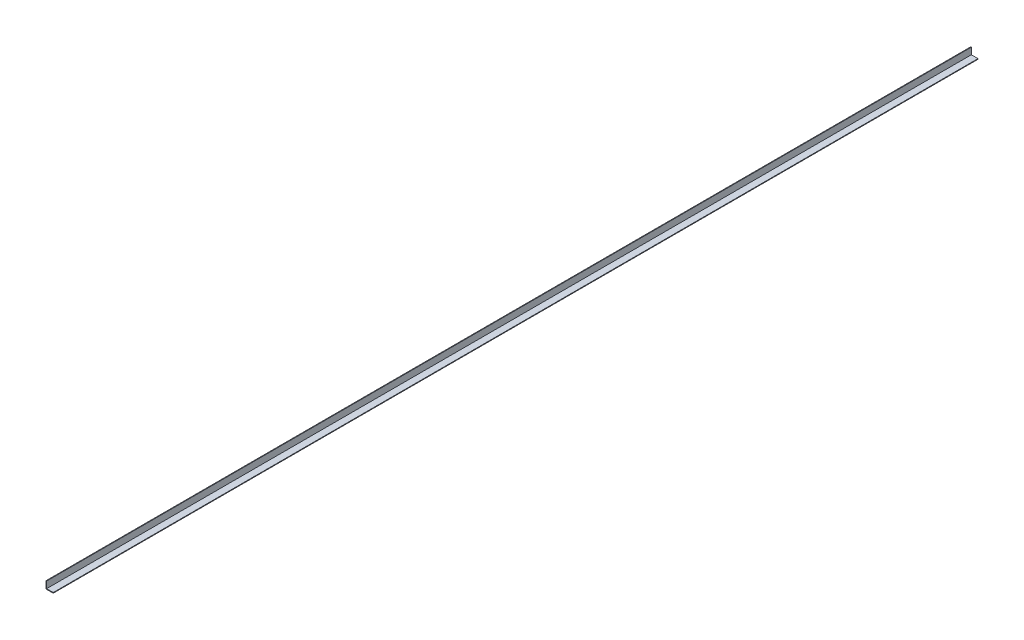
ISO-10303-21;
HEADER;
FILE_DESCRIPTION(('STEP AP214'),'2;1');
FILE_NAME('part.step','',(''),(''),'','','');
FILE_SCHEMA(('AUTOMOTIVE_DESIGN { 1 0 10303 214 1 1 1 1 }'));
ENDSEC;
DATA;
#1=APPLICATION_CONTEXT('core data for automotive mechanical design processes');
#2=APPLICATION_PROTOCOL_DEFINITION('international standard','automotive_design',2000,#1);
#3=PRODUCT_CONTEXT('',#1,'mechanical');
#4=PRODUCT('Part','Part','',(#3));
#5=PRODUCT_RELATED_PRODUCT_CATEGORY('part','',(#4));
#6=PRODUCT_DEFINITION_FORMATION('','',#4);
#7=PRODUCT_DEFINITION_CONTEXT('part definition',#1,'design');
#8=PRODUCT_DEFINITION('design','',#6,#7);
#9=PRODUCT_DEFINITION_SHAPE('','',#8);
#10=(LENGTH_UNIT() NAMED_UNIT(*) SI_UNIT(.MILLI.,.METRE.));
#11=(NAMED_UNIT(*) PLANE_ANGLE_UNIT() SI_UNIT($,.RADIAN.));
#12=(NAMED_UNIT(*) SI_UNIT($,.STERADIAN.) SOLID_ANGLE_UNIT());
#13=UNCERTAINTY_MEASURE_WITH_UNIT(LENGTH_MEASURE(1.E-05),#10,'distance_accuracy_value','');
#14=(GEOMETRIC_REPRESENTATION_CONTEXT(3) GLOBAL_UNCERTAINTY_ASSIGNED_CONTEXT((#13)) GLOBAL_UNIT_ASSIGNED_CONTEXT((#10,
#11,#12)) REPRESENTATION_CONTEXT('',''));
#15=CARTESIAN_POINT('',(0.,0.,0.));
#16=DIRECTION('',(0.,0.,1.));
#17=DIRECTION('',(1.,0.,0.));
#18=AXIS2_PLACEMENT_3D('',#15,#16,#17);
#19=CARTESIAN_POINT('',(19.05,-7.9375,2438.4));
#20=DIRECTION('',(-1.,0.,0.));
#21=DIRECTION('',(0.,-1.,0.));
#22=AXIS2_PLACEMENT_3D('',#19,#20,#21);
#23=PLANE('',#22);
#24=DIRECTION('',(0.,1.,0.));
#25=VECTOR('',#24,1.);
#26=CARTESIAN_POINT('',(19.05,-7.9375,0.));
#27=LINE('',#26,#25);
#28=CARTESIAN_POINT('',(19.05,-9.52500000000001,0.));
#29=VERTEX_POINT('',#28);
#30=CARTESIAN_POINT('',(19.05,-7.9375,0.));
#31=VERTEX_POINT('',#30);
#32=EDGE_CURVE('E117',#29,#31,#27,.T.);
#33=ORIENTED_EDGE('',*,*,#32,.T.);
#34=DIRECTION('',(0.,0.,-1.));
#35=VECTOR('',#34,1.);
#36=CARTESIAN_POINT('',(19.05,-7.9375,2438.4));
#37=LINE('',#36,#35);
#38=CARTESIAN_POINT('',(19.05,-7.9375,2438.4));
#39=VERTEX_POINT('',#38);
#40=EDGE_CURVE('E11',#39,#31,#37,.T.);
#41=ORIENTED_EDGE('',*,*,#40,.F.);
#42=DIRECTION('',(0.,1.,0.));
#43=VECTOR('',#42,1.);
#44=CARTESIAN_POINT('',(19.05,-7.9375,2438.4));
#45=LINE('',#44,#43);
#46=CARTESIAN_POINT('',(19.05,-9.52500000000001,2438.4));
#47=VERTEX_POINT('',#46);
#48=EDGE_CURVE('E127',#47,#39,#45,.T.);
#49=ORIENTED_EDGE('',*,*,#48,.F.);
#50=DIRECTION('',(0.,0.,-1.));
#51=VECTOR('',#50,1.);
#52=CARTESIAN_POINT('',(19.05,-9.52500000000001,2438.4));
#53=LINE('',#52,#51);
#54=EDGE_CURVE('E113',#47,#29,#53,.T.);
#55=ORIENTED_EDGE('',*,*,#54,.T.);
#56=EDGE_LOOP('',(#33,#41,#49,#55));
#57=FACE_BOUND('',#56,.T.);
#58=ADVANCED_FACE('F33',(#57),#23,.F.);
#59=CARTESIAN_POINT('',(1.5875,-7.9375,2438.4));
#60=DIRECTION('',(0.,-1.,0.));
#61=DIRECTION('',(0.,0.,-1.));
#62=AXIS2_PLACEMENT_3D('',#59,#60,#61);
#63=PLANE('',#62);
#64=DIRECTION('',(-1.,0.,0.));
#65=VECTOR('',#64,1.);
#66=CARTESIAN_POINT('',(1.5875,-7.9375,0.));
#67=LINE('',#66,#65);
#68=CARTESIAN_POINT('',(1.5875,-7.9375,0.));
#69=VERTEX_POINT('',#68);
#70=EDGE_CURVE('E120',#31,#69,#67,.T.);
#71=ORIENTED_EDGE('',*,*,#70,.T.);
#72=DIRECTION('',(0.,0.,-1.));
#73=VECTOR('',#72,1.);
#74=CARTESIAN_POINT('',(1.5875,-7.9375,2438.4));
#75=LINE('',#74,#73);
#76=CARTESIAN_POINT('',(1.5875,-7.9375,2438.4));
#77=VERTEX_POINT('',#76);
#78=EDGE_CURVE('E41',#77,#69,#75,.T.);
#79=ORIENTED_EDGE('',*,*,#78,.F.);
#80=DIRECTION('',(-1.,0.,0.));
#81=VECTOR('',#80,1.);
#82=CARTESIAN_POINT('',(1.5875,-7.9375,2438.4));
#83=LINE('',#82,#81);
#84=EDGE_CURVE('E86',#39,#77,#83,.T.);
#85=ORIENTED_EDGE('',*,*,#84,.F.);
#86=ORIENTED_EDGE('',*,*,#40,.T.);
#87=EDGE_LOOP('',(#71,#79,#85,#86));
#88=FACE_BOUND('',#87,.T.);
#89=ADVANCED_FACE('F151',(#88),#63,.F.);
#90=CARTESIAN_POINT('',(1.5875,9.52500000000001,2438.4));
#91=DIRECTION('',(-1.,0.,0.));
#92=DIRECTION('',(0.,-1.,0.));
#93=AXIS2_PLACEMENT_3D('',#90,#91,#92);
#94=PLANE('',#93);
#95=DIRECTION('',(0.,1.,0.));
#96=VECTOR('',#95,1.);
#97=CARTESIAN_POINT('',(1.5875,9.52500000000001,0.));
#98=LINE('',#97,#96);
#99=CARTESIAN_POINT('',(1.5875,9.52500000000001,0.));
#100=VERTEX_POINT('',#99);
#101=EDGE_CURVE('E122',#69,#100,#98,.T.);
#102=ORIENTED_EDGE('',*,*,#101,.T.);
#103=DIRECTION('',(0.,0.,-1.));
#104=VECTOR('',#103,1.);
#105=CARTESIAN_POINT('',(1.5875,9.52500000000001,2438.4));
#106=LINE('',#105,#104);
#107=CARTESIAN_POINT('',(1.5875,9.52500000000001,2438.4));
#108=VERTEX_POINT('',#107);
#109=EDGE_CURVE('E108',#108,#100,#106,.T.);
#110=ORIENTED_EDGE('',*,*,#109,.F.);
#111=DIRECTION('',(0.,1.,0.));
#112=VECTOR('',#111,1.);
#113=CARTESIAN_POINT('',(1.5875,9.52500000000001,2438.4));
#114=LINE('',#113,#112);
#115=EDGE_CURVE('E99',#77,#108,#114,.T.);
#116=ORIENTED_EDGE('',*,*,#115,.F.);
#117=ORIENTED_EDGE('',*,*,#78,.T.);
#118=EDGE_LOOP('',(#102,#110,#116,#117));
#119=FACE_BOUND('',#118,.T.);
#120=ADVANCED_FACE('F133',(#119),#94,.F.);
#121=CARTESIAN_POINT('',(0.,9.52500000000001,2438.4));
#122=DIRECTION('',(0.,-1.,0.));
#123=DIRECTION('',(0.,0.,-1.));
#124=AXIS2_PLACEMENT_3D('',#121,#122,#123);
#125=PLANE('',#124);
#126=DIRECTION('',(-1.,0.,0.));
#127=VECTOR('',#126,1.);
#128=CARTESIAN_POINT('',(0.,9.52500000000001,0.));
#129=LINE('',#128,#127);
#130=CARTESIAN_POINT('',(0.,9.52500000000001,0.));
#131=VERTEX_POINT('',#130);
#132=EDGE_CURVE('E107',#100,#131,#129,.T.);
#133=ORIENTED_EDGE('',*,*,#132,.T.);
#134=DIRECTION('',(0.,0.,-1.));
#135=VECTOR('',#134,1.);
#136=CARTESIAN_POINT('',(0.,9.52500000000001,2438.4));
#137=LINE('',#136,#135);
#138=CARTESIAN_POINT('',(0.,9.52500000000001,2438.4));
#139=VERTEX_POINT('',#138);
#140=EDGE_CURVE('E104',#139,#131,#137,.T.);
#141=ORIENTED_EDGE('',*,*,#140,.F.);
#142=DIRECTION('',(-1.,0.,0.));
#143=VECTOR('',#142,1.);
#144=CARTESIAN_POINT('',(0.,9.52500000000001,2438.4));
#145=LINE('',#144,#143);
#146=EDGE_CURVE('E93',#108,#139,#145,.T.);
#147=ORIENTED_EDGE('',*,*,#146,.F.);
#148=ORIENTED_EDGE('',*,*,#109,.T.);
#149=EDGE_LOOP('',(#133,#141,#147,#148));
#150=FACE_BOUND('',#149,.T.);
#151=ADVANCED_FACE('F105',(#150),#125,.F.);
#152=CARTESIAN_POINT('',(0.,-9.52500000000001,2438.4));
#153=DIRECTION('',(1.,0.,0.));
#154=DIRECTION('',(0.,1.,0.));
#155=AXIS2_PLACEMENT_3D('',#152,#153,#154);
#156=PLANE('',#155);
#157=DIRECTION('',(0.,-1.,0.));
#158=VECTOR('',#157,1.);
#159=CARTESIAN_POINT('',(0.,-9.52500000000001,0.));
#160=LINE('',#159,#158);
#161=CARTESIAN_POINT('',(0.,-9.52500000000001,0.));
#162=VERTEX_POINT('',#161);
#163=EDGE_CURVE('E72',#131,#162,#160,.T.);
#164=ORIENTED_EDGE('',*,*,#163,.T.);
#165=DIRECTION('',(0.,0.,-1.));
#166=VECTOR('',#165,1.);
#167=CARTESIAN_POINT('',(0.,-9.52500000000001,2438.4));
#168=LINE('',#167,#166);
#169=CARTESIAN_POINT('',(0.,-9.52500000000001,2438.4));
#170=VERTEX_POINT('',#169);
#171=EDGE_CURVE('E109',#170,#162,#168,.T.);
#172=ORIENTED_EDGE('',*,*,#171,.F.);
#173=DIRECTION('',(0.,-1.,0.));
#174=VECTOR('',#173,1.);
#175=CARTESIAN_POINT('',(0.,-9.52500000000001,2438.4));
#176=LINE('',#175,#174);
#177=EDGE_CURVE('E97',#139,#170,#176,.T.);
#178=ORIENTED_EDGE('',*,*,#177,.F.);
#179=ORIENTED_EDGE('',*,*,#140,.T.);
#180=EDGE_LOOP('',(#164,#172,#178,#179));
#181=FACE_BOUND('',#180,.T.);
#182=ADVANCED_FACE('F111',(#181),#156,.F.);
#183=CARTESIAN_POINT('',(19.05,-9.52500000000001,2438.4));
#184=DIRECTION('',(0.,1.,0.));
#185=DIRECTION('',(0.,0.,1.));
#186=AXIS2_PLACEMENT_3D('',#183,#184,#185);
#187=PLANE('',#186);
#188=DIRECTION('',(1.,0.,0.));
#189=VECTOR('',#188,1.);
#190=CARTESIAN_POINT('',(19.05,-9.52500000000001,0.));
#191=LINE('',#190,#189);
#192=EDGE_CURVE('E78',#162,#29,#191,.T.);
#193=ORIENTED_EDGE('',*,*,#192,.T.);
#194=ORIENTED_EDGE('',*,*,#54,.F.);
#195=DIRECTION('',(1.,0.,0.));
#196=VECTOR('',#195,1.);
#197=CARTESIAN_POINT('',(19.05,-9.52500000000001,2438.4));
#198=LINE('',#197,#196);
#199=EDGE_CURVE('E49',#170,#47,#198,.T.);
#200=ORIENTED_EDGE('',*,*,#199,.F.);
#201=ORIENTED_EDGE('',*,*,#171,.T.);
#202=EDGE_LOOP('',(#193,#194,#200,#201));
#203=FACE_BOUND('',#202,.T.);
#204=ADVANCED_FACE('F140',(#203),#187,.F.);
#205=CARTESIAN_POINT('',(0.,0.,2438.4));
#206=DIRECTION('',(0.,0.,-1.));
#207=DIRECTION('',(-1.,0.,0.));
#208=AXIS2_PLACEMENT_3D('',#205,#206,#207);
#209=PLANE('',#208);
#210=ORIENTED_EDGE('',*,*,#48,.T.);
#211=ORIENTED_EDGE('',*,*,#84,.T.);
#212=ORIENTED_EDGE('',*,*,#115,.T.);
#213=ORIENTED_EDGE('',*,*,#146,.T.);
#214=ORIENTED_EDGE('',*,*,#177,.T.);
#215=ORIENTED_EDGE('',*,*,#199,.T.);
#216=EDGE_LOOP('',(#210,#211,#212,#213,#214,#215));
#217=FACE_BOUND('',#216,.T.);
#218=ADVANCED_FACE('F95',(#217),#209,.F.);
#219=CARTESIAN_POINT('',(0.,0.,0.));
#220=DIRECTION('',(0.,0.,-1.));
#221=DIRECTION('',(-1.,0.,0.));
#222=AXIS2_PLACEMENT_3D('',#219,#220,#221);
#223=PLANE('',#222);
#224=ORIENTED_EDGE('',*,*,#32,.F.);
#225=ORIENTED_EDGE('',*,*,#192,.F.);
#226=ORIENTED_EDGE('',*,*,#163,.F.);
#227=ORIENTED_EDGE('',*,*,#132,.F.);
#228=ORIENTED_EDGE('',*,*,#101,.F.);
#229=ORIENTED_EDGE('',*,*,#70,.F.);
#230=EDGE_LOOP('',(#224,#225,#226,#227,#228,#229));
#231=FACE_BOUND('',#230,.T.);
#232=ADVANCED_FACE('F136',(#231),#223,.T.);
#233=CLOSED_SHELL('',(#58,#89,#120,#151,#182,#204,#218,#232));
#234=MANIFOLD_SOLID_BREP('B2',#233);
#235=ADVANCED_BREP_SHAPE_REPRESENTATION('',(#18,#234),#14);
#236=SHAPE_DEFINITION_REPRESENTATION(#9,#235);
ENDSEC;
END-ISO-10303-21;
